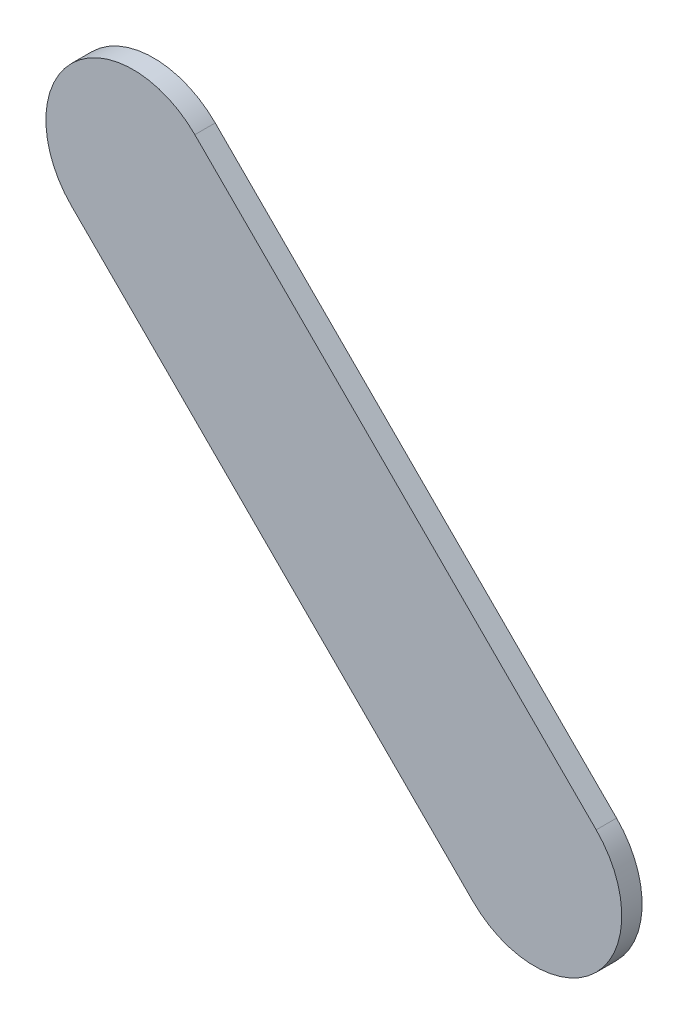
ISO-10303-21;
HEADER;
FILE_DESCRIPTION(('STEP AP214'),'2;1');
FILE_NAME('part.step','',(''),(''),'','','');
FILE_SCHEMA(('AUTOMOTIVE_DESIGN { 1 0 10303 214 1 1 1 1 }'));
ENDSEC;
DATA;
#1=APPLICATION_CONTEXT('core data for automotive mechanical design processes');
#2=APPLICATION_PROTOCOL_DEFINITION('international standard','automotive_design',2000,#1);
#3=PRODUCT_CONTEXT('',#1,'mechanical');
#4=PRODUCT('Part','Part','',(#3));
#5=PRODUCT_RELATED_PRODUCT_CATEGORY('part','',(#4));
#6=PRODUCT_DEFINITION_FORMATION('','',#4);
#7=PRODUCT_DEFINITION_CONTEXT('part definition',#1,'design');
#8=PRODUCT_DEFINITION('design','',#6,#7);
#9=PRODUCT_DEFINITION_SHAPE('','',#8);
#10=(LENGTH_UNIT() NAMED_UNIT(*) SI_UNIT(.MILLI.,.METRE.));
#11=(NAMED_UNIT(*) PLANE_ANGLE_UNIT() SI_UNIT($,.RADIAN.));
#12=(NAMED_UNIT(*) SI_UNIT($,.STERADIAN.) SOLID_ANGLE_UNIT());
#13=UNCERTAINTY_MEASURE_WITH_UNIT(LENGTH_MEASURE(1.E-05),#10,'distance_accuracy_value','');
#14=(GEOMETRIC_REPRESENTATION_CONTEXT(3) GLOBAL_UNCERTAINTY_ASSIGNED_CONTEXT((#13)) GLOBAL_UNIT_ASSIGNED_CONTEXT((#10,
#11,#12)) REPRESENTATION_CONTEXT('',''));
#15=CARTESIAN_POINT('',(0.,0.,0.));
#16=DIRECTION('',(0.,0.,1.));
#17=DIRECTION('',(1.,0.,0.));
#18=AXIS2_PLACEMENT_3D('',#15,#16,#17);
#19=CARTESIAN_POINT('',(148.186066,-113.303933,1.635));
#20=DIRECTION('',(0.,0.,1.));
#21=DIRECTION('',(1.,0.,0.));
#22=AXIS2_PLACEMENT_3D('',#19,#20,#21);
#23=PLANE('',#22);
#24=DIRECTION('',(-0.707106781186548,0.707106781186548,0.));
#25=VECTOR('',#24,1.);
#26=CARTESIAN_POINT('',(148.186066,-113.303933,1.635));
#27=LINE('',#26,#25);
#28=CARTESIAN_POINT('',(148.186066,-113.303933,1.635));
#29=VERTEX_POINT('',#28);
#30=CARTESIAN_POINT('',(147.496066,-112.613933,1.635));
#31=VERTEX_POINT('',#30);
#32=EDGE_CURVE('E71',#29,#31,#27,.T.);
#33=ORIENTED_EDGE('',*,*,#32,.T.);
#34=CARTESIAN_POINT('',(147.3899995,-112.7199995,1.635));
#35=DIRECTION('',(0.,0.,1.));
#36=DIRECTION('',(0.707106781187048,0.707106781186048,0.));
#37=AXIS2_PLACEMENT_3D('',#34,#35,#36);
#38=CIRCLE('',#37,0.150000682813);
#39=CARTESIAN_POINT('',(147.283933,-112.826066,1.635));
#40=VERTEX_POINT('',#39);
#41=EDGE_CURVE('E104',#31,#40,#38,.T.);
#42=ORIENTED_EDGE('',*,*,#41,.T.);
#43=DIRECTION('',(0.707106781186548,-0.707106781186548,0.));
#44=VECTOR('',#43,1.);
#45=CARTESIAN_POINT('',(147.283933,-112.826066,1.635));
#46=LINE('',#45,#44);
#47=CARTESIAN_POINT('',(147.973933,-113.516066,1.635));
#48=VERTEX_POINT('',#47);
#49=EDGE_CURVE('E73',#40,#48,#46,.T.);
#50=ORIENTED_EDGE('',*,*,#49,.T.);
#51=CARTESIAN_POINT('',(148.0799995,-113.4099995,1.635));
#52=DIRECTION('',(0.,0.,1.));
#53=DIRECTION('',(-0.707106781186548,-0.707106781186548,0.));
#54=AXIS2_PLACEMENT_3D('',#51,#52,#53);
#55=CIRCLE('',#54,0.150000682813);
#56=EDGE_CURVE('E11',#48,#29,#55,.T.);
#57=ORIENTED_EDGE('',*,*,#56,.T.);
#58=EDGE_LOOP('',(#33,#42,#50,#57));
#59=FACE_BOUND('',#58,.T.);
#60=ADVANCED_FACE('F17',(#59),#23,.T.);
#61=CARTESIAN_POINT('',(148.186066,-113.303933,1.6));
#62=DIRECTION('',(0.,0.,1.));
#63=DIRECTION('',(1.,0.,0.));
#64=AXIS2_PLACEMENT_3D('',#61,#62,#63);
#65=PLANE('',#64);
#66=CARTESIAN_POINT('',(148.0799995,-113.4099995,1.6));
#67=DIRECTION('',(0.,0.,1.));
#68=DIRECTION('',(-0.707106781186548,-0.707106781186548,0.));
#69=AXIS2_PLACEMENT_3D('',#66,#67,#68);
#70=CIRCLE('',#69,0.150000682813);
#71=CARTESIAN_POINT('',(147.973933,-113.516066,1.6));
#72=VERTEX_POINT('',#71);
#73=CARTESIAN_POINT('',(148.186066,-113.303933,1.6));
#74=VERTEX_POINT('',#73);
#75=EDGE_CURVE('E27',#72,#74,#70,.T.);
#76=ORIENTED_EDGE('',*,*,#75,.F.);
#77=DIRECTION('',(0.707106781186548,-0.707106781186548,0.));
#78=VECTOR('',#77,1.);
#79=CARTESIAN_POINT('',(147.283933,-112.826066,1.6));
#80=LINE('',#79,#78);
#81=CARTESIAN_POINT('',(147.283933,-112.826066,1.6));
#82=VERTEX_POINT('',#81);
#83=EDGE_CURVE('E61',#82,#72,#80,.T.);
#84=ORIENTED_EDGE('',*,*,#83,.F.);
#85=CARTESIAN_POINT('',(147.3899995,-112.7199995,1.6));
#86=DIRECTION('',(0.,0.,1.));
#87=DIRECTION('',(0.707106781187048,0.707106781186048,0.));
#88=AXIS2_PLACEMENT_3D('',#85,#86,#87);
#89=CIRCLE('',#88,0.150000682813);
#90=CARTESIAN_POINT('',(147.496066,-112.613933,1.6));
#91=VERTEX_POINT('',#90);
#92=EDGE_CURVE('E83',#91,#82,#89,.T.);
#93=ORIENTED_EDGE('',*,*,#92,.F.);
#94=DIRECTION('',(-0.707106781186548,0.707106781186548,0.));
#95=VECTOR('',#94,1.);
#96=CARTESIAN_POINT('',(148.186066,-113.303933,1.6));
#97=LINE('',#96,#95);
#98=EDGE_CURVE('E94',#74,#91,#97,.T.);
#99=ORIENTED_EDGE('',*,*,#98,.F.);
#100=EDGE_LOOP('',(#76,#84,#93,#99));
#101=FACE_BOUND('',#100,.T.);
#102=ADVANCED_FACE('F19',(#101),#65,.F.);
#103=CARTESIAN_POINT('',(148.0799995,-113.4099995,1.6));
#104=DIRECTION('',(0.,0.,-1.));
#105=DIRECTION('',(-0.707106781186548,-0.707106781186548,0.));
#106=AXIS2_PLACEMENT_3D('',#103,#104,#105);
#107=CYLINDRICAL_SURFACE('',#106,0.150000682813);
#108=ORIENTED_EDGE('',*,*,#75,.T.);
#109=DIRECTION('',(0.,0.,1.));
#110=VECTOR('',#109,1.);
#111=CARTESIAN_POINT('',(148.186066,-113.303933,1.6));
#112=LINE('',#111,#110);
#113=EDGE_CURVE('E77',#74,#29,#112,.T.);
#114=ORIENTED_EDGE('',*,*,#113,.T.);
#115=ORIENTED_EDGE('',*,*,#56,.F.);
#116=DIRECTION('',(0.,0.,1.));
#117=VECTOR('',#116,1.);
#118=CARTESIAN_POINT('',(147.973933,-113.516066,1.6));
#119=LINE('',#118,#117);
#120=EDGE_CURVE('E107',#72,#48,#119,.T.);
#121=ORIENTED_EDGE('',*,*,#120,.F.);
#122=EDGE_LOOP('',(#108,#114,#115,#121));
#123=FACE_BOUND('',#122,.T.);
#124=ADVANCED_FACE('F78',(#123),#107,.T.);
#125=CARTESIAN_POINT('',(147.283933,-112.826066,1.6));
#126=DIRECTION('',(0.707106781186548,0.707106781186548,0.));
#127=DIRECTION('',(0.,0.,-1.));
#128=AXIS2_PLACEMENT_3D('',#125,#126,#127);
#129=PLANE('',#128);
#130=ORIENTED_EDGE('',*,*,#83,.T.);
#131=ORIENTED_EDGE('',*,*,#120,.T.);
#132=ORIENTED_EDGE('',*,*,#49,.F.);
#133=DIRECTION('',(0.,0.,1.));
#134=VECTOR('',#133,1.);
#135=CARTESIAN_POINT('',(147.283933,-112.826066,1.6));
#136=LINE('',#135,#134);
#137=EDGE_CURVE('E103',#82,#40,#136,.T.);
#138=ORIENTED_EDGE('',*,*,#137,.F.);
#139=EDGE_LOOP('',(#130,#131,#132,#138));
#140=FACE_BOUND('',#139,.T.);
#141=ADVANCED_FACE('F155',(#140),#129,.F.);
#142=CARTESIAN_POINT('',(147.3899995,-112.7199995,1.6));
#143=DIRECTION('',(0.,0.,-1.));
#144=DIRECTION('',(0.707106781187048,0.707106781186048,0.));
#145=AXIS2_PLACEMENT_3D('',#142,#143,#144);
#146=CYLINDRICAL_SURFACE('',#145,0.150000682813);
#147=ORIENTED_EDGE('',*,*,#92,.T.);
#148=ORIENTED_EDGE('',*,*,#137,.T.);
#149=ORIENTED_EDGE('',*,*,#41,.F.);
#150=DIRECTION('',(0.,0.,1.));
#151=VECTOR('',#150,1.);
#152=CARTESIAN_POINT('',(147.496066,-112.613933,1.6));
#153=LINE('',#152,#151);
#154=EDGE_CURVE('E87',#91,#31,#153,.T.);
#155=ORIENTED_EDGE('',*,*,#154,.F.);
#156=EDGE_LOOP('',(#147,#148,#149,#155));
#157=FACE_BOUND('',#156,.T.);
#158=ADVANCED_FACE('F153',(#157),#146,.T.);
#159=CARTESIAN_POINT('',(148.186066,-113.303933,1.6));
#160=DIRECTION('',(-0.707106781186548,-0.707106781186548,0.));
#161=DIRECTION('',(-0.707106781186548,0.707106781186548,0.));
#162=AXIS2_PLACEMENT_3D('',#159,#160,#161);
#163=PLANE('',#162);
#164=ORIENTED_EDGE('',*,*,#98,.T.);
#165=ORIENTED_EDGE('',*,*,#154,.T.);
#166=ORIENTED_EDGE('',*,*,#32,.F.);
#167=ORIENTED_EDGE('',*,*,#113,.F.);
#168=EDGE_LOOP('',(#164,#165,#166,#167));
#169=FACE_BOUND('',#168,.T.);
#170=ADVANCED_FACE('F85',(#169),#163,.F.);
#171=CLOSED_SHELL('',(#60,#102,#124,#141,#158,#170));
#172=MANIFOLD_SOLID_BREP('B1',#171);
#173=ADVANCED_BREP_SHAPE_REPRESENTATION('',(#18,#172),#14);
#174=SHAPE_DEFINITION_REPRESENTATION(#9,#173);
ENDSEC;
END-ISO-10303-21;
